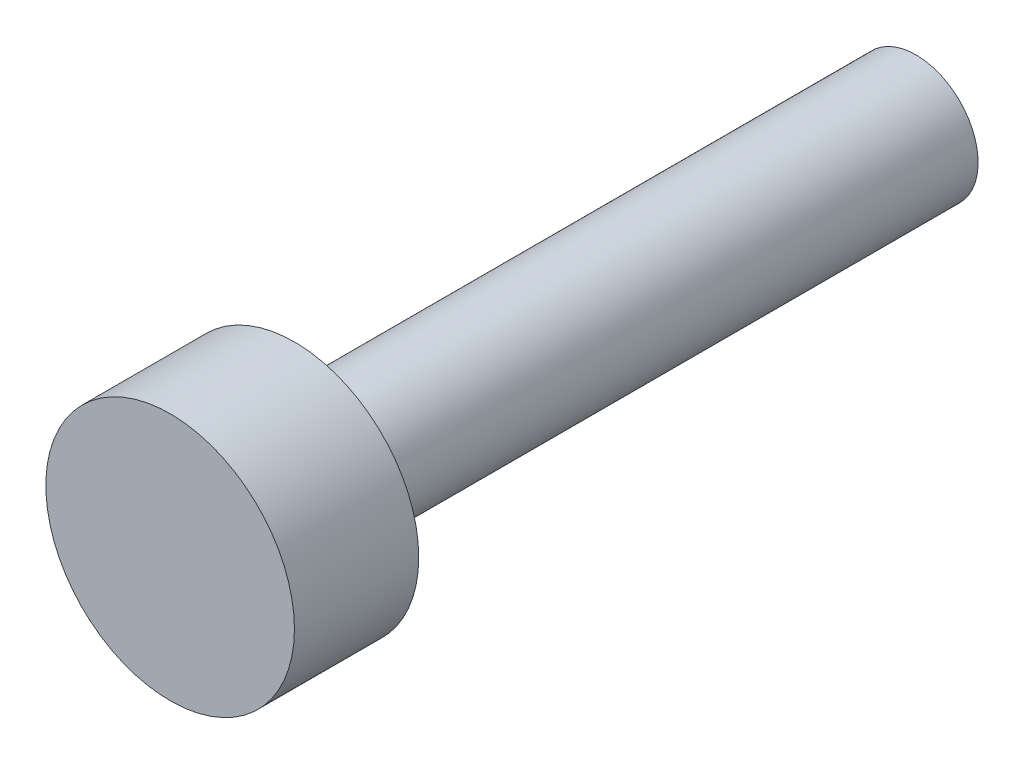
ISO-10303-21;
HEADER;
FILE_DESCRIPTION(('STEP AP214'),'2;1');
FILE_NAME('part.step','',(''),(''),'','','');
FILE_SCHEMA(('AUTOMOTIVE_DESIGN { 1 0 10303 214 1 1 1 1 }'));
ENDSEC;
DATA;
#1=APPLICATION_CONTEXT('core data for automotive mechanical design processes');
#2=APPLICATION_PROTOCOL_DEFINITION('international standard','automotive_design',2000,#1);
#3=PRODUCT_CONTEXT('',#1,'mechanical');
#4=PRODUCT('Part','Part','',(#3));
#5=PRODUCT_RELATED_PRODUCT_CATEGORY('part','',(#4));
#6=PRODUCT_DEFINITION_FORMATION('','',#4);
#7=PRODUCT_DEFINITION_CONTEXT('part definition',#1,'design');
#8=PRODUCT_DEFINITION('design','',#6,#7);
#9=PRODUCT_DEFINITION_SHAPE('','',#8);
#10=(LENGTH_UNIT() NAMED_UNIT(*) SI_UNIT(.MILLI.,.METRE.));
#11=(NAMED_UNIT(*) PLANE_ANGLE_UNIT() SI_UNIT($,.RADIAN.));
#12=(NAMED_UNIT(*) SI_UNIT($,.STERADIAN.) SOLID_ANGLE_UNIT());
#13=UNCERTAINTY_MEASURE_WITH_UNIT(LENGTH_MEASURE(1.E-05),#10,'distance_accuracy_value','');
#14=(GEOMETRIC_REPRESENTATION_CONTEXT(3) GLOBAL_UNCERTAINTY_ASSIGNED_CONTEXT((#13)) GLOBAL_UNIT_ASSIGNED_CONTEXT((#10,
#11,#12)) REPRESENTATION_CONTEXT('',''));
#15=CARTESIAN_POINT('',(0.,0.,0.));
#16=DIRECTION('',(0.,0.,1.));
#17=DIRECTION('',(1.,0.,0.));
#18=AXIS2_PLACEMENT_3D('',#15,#16,#17);
#19=CARTESIAN_POINT('',(0.,0.,19.05));
#20=DIRECTION('',(0.,0.,-1.));
#21=DIRECTION('',(-1.,0.,0.));
#22=AXIS2_PLACEMENT_3D('',#19,#20,#21);
#23=CYLINDRICAL_SURFACE('',#22,1.5875);
#24=CARTESIAN_POINT('',(0.,0.,0.));
#25=DIRECTION('',(0.,0.,1.));
#26=DIRECTION('',(1.,0.,0.));
#27=AXIS2_PLACEMENT_3D('',#24,#25,#26);
#28=CIRCLE('',#27,1.5875);
#29=CARTESIAN_POINT('',(-1.5875,0.,0.));
#30=VERTEX_POINT('',#29);
#31=EDGE_CURVE('E48',#30,#30,#28,.T.);
#32=CARTESIAN_POINT('',(0.,0.,15.875));
#33=DIRECTION('',(0.,0.,1.));
#34=DIRECTION('',(1.,0.,0.));
#35=AXIS2_PLACEMENT_3D('',#32,#33,#34);
#36=CIRCLE('',#35,1.5875);
#37=CARTESIAN_POINT('',(-1.5875,0.,15.875));
#38=VERTEX_POINT('',#37);
#39=EDGE_CURVE('E10',#38,#38,#36,.T.);
#40=CARTESIAN_POINT('',(-1.5875,0.,0.));
#41=CARTESIAN_POINT('',(-1.5875,0.,0.165364583333333));
#42=CARTESIAN_POINT('',(-1.5875,0.,0.330729166666666));
#43=CARTESIAN_POINT('',(-1.5875,0.,0.661458333333332));
#44=CARTESIAN_POINT('',(-1.5875,0.,0.826822916666665));
#45=CARTESIAN_POINT('',(-1.5875,0.,1.15755208333333));
#46=CARTESIAN_POINT('',(-1.5875,0.,1.32291666666667));
#47=CARTESIAN_POINT('',(-1.5875,0.,1.65364583333333));
#48=CARTESIAN_POINT('',(-1.5875,0.,1.81901041666667));
#49=CARTESIAN_POINT('',(-1.5875,0.,2.14973958333333));
#50=CARTESIAN_POINT('',(-1.5875,0.,2.31510416666667));
#51=CARTESIAN_POINT('',(-1.5875,0.,2.64583333333333));
#52=CARTESIAN_POINT('',(-1.5875,0.,2.81119791666667));
#53=CARTESIAN_POINT('',(-1.5875,0.,3.14192708333333));
#54=CARTESIAN_POINT('',(-1.5875,0.,3.30729166666667));
#55=CARTESIAN_POINT('',(-1.5875,0.,3.63802083333333));
#56=CARTESIAN_POINT('',(-1.5875,0.,3.80338541666667));
#57=CARTESIAN_POINT('',(-1.5875,0.,4.13411458333333));
#58=CARTESIAN_POINT('',(-1.5875,0.,4.29947916666666));
#59=CARTESIAN_POINT('',(-1.5875,0.,4.63020833333333));
#60=CARTESIAN_POINT('',(-1.5875,0.,4.79557291666667));
#61=CARTESIAN_POINT('',(-1.5875,0.,5.12630208333333));
#62=CARTESIAN_POINT('',(-1.5875,0.,5.29166666666667));
#63=CARTESIAN_POINT('',(-1.5875,0.,5.62239583333333));
#64=CARTESIAN_POINT('',(-1.5875,0.,5.78776041666667));
#65=CARTESIAN_POINT('',(-1.5875,0.,6.11848958333333));
#66=CARTESIAN_POINT('',(-1.5875,0.,6.28385416666666));
#67=CARTESIAN_POINT('',(-1.5875,0.,6.61458333333333));
#68=CARTESIAN_POINT('',(-1.5875,0.,6.77994791666667));
#69=CARTESIAN_POINT('',(-1.5875,0.,7.11067708333333));
#70=CARTESIAN_POINT('',(-1.5875,0.,7.27604166666667));
#71=CARTESIAN_POINT('',(-1.5875,0.,7.60677083333333));
#72=CARTESIAN_POINT('',(-1.5875,0.,7.77213541666667));
#73=CARTESIAN_POINT('',(-1.5875,0.,8.10286458333333));
#74=CARTESIAN_POINT('',(-1.5875,0.,8.26822916666666));
#75=CARTESIAN_POINT('',(-1.5875,0.,8.59895833333333));
#76=CARTESIAN_POINT('',(-1.5875,0.,8.76432291666666));
#77=CARTESIAN_POINT('',(-1.5875,0.,9.09505208333333));
#78=CARTESIAN_POINT('',(-1.5875,0.,9.26041666666666));
#79=CARTESIAN_POINT('',(-1.5875,0.,9.59114583333333));
#80=CARTESIAN_POINT('',(-1.5875,0.,9.75651041666667));
#81=CARTESIAN_POINT('',(-1.5875,0.,10.0872395833333));
#82=CARTESIAN_POINT('',(-1.5875,0.,10.2526041666667));
#83=CARTESIAN_POINT('',(-1.5875,0.,10.5833333333333));
#84=CARTESIAN_POINT('',(-1.5875,0.,10.7486979166667));
#85=CARTESIAN_POINT('',(-1.5875,0.,11.0794270833333));
#86=CARTESIAN_POINT('',(-1.5875,0.,11.2447916666667));
#87=CARTESIAN_POINT('',(-1.5875,0.,11.5755208333333));
#88=CARTESIAN_POINT('',(-1.5875,0.,11.7408854166667));
#89=CARTESIAN_POINT('',(-1.5875,0.,12.0716145833333));
#90=CARTESIAN_POINT('',(-1.5875,0.,12.2369791666667));
#91=CARTESIAN_POINT('',(-1.5875,0.,12.5677083333333));
#92=CARTESIAN_POINT('',(-1.5875,0.,12.7330729166667));
#93=CARTESIAN_POINT('',(-1.5875,0.,13.0638020833333));
#94=CARTESIAN_POINT('',(-1.5875,0.,13.2291666666667));
#95=CARTESIAN_POINT('',(-1.5875,0.,13.5598958333333));
#96=CARTESIAN_POINT('',(-1.5875,0.,13.7252604166667));
#97=CARTESIAN_POINT('',(-1.5875,0.,14.0559895833333));
#98=CARTESIAN_POINT('',(-1.5875,0.,14.2213541666667));
#99=CARTESIAN_POINT('',(-1.5875,0.,14.5520833333333));
#100=CARTESIAN_POINT('',(-1.5875,0.,14.7174479166667));
#101=CARTESIAN_POINT('',(-1.5875,0.,15.0481770833333));
#102=CARTESIAN_POINT('',(-1.5875,0.,15.2135416666667));
#103=CARTESIAN_POINT('',(-1.5875,0.,15.5442708333333));
#104=CARTESIAN_POINT('',(-1.5875,0.,15.7096354166667));
#105=CARTESIAN_POINT('',(-1.5875,0.,15.875));
#106=B_SPLINE_CURVE_WITH_KNOTS('',3,(#40,#41,#42,#43,#44,#45,#46,#47,#48,#49,#50,#51,#52,#53,
#54,#55,#56,#57,#58,#59,#60,#61,#62,#63,#64,#65,#66,#67,#68,#69,#70,#71,#72,#73,#74,#75,#76,#77,
#78,#79,#80,#81,#82,#83,#84,#85,#86,#87,#88,#89,#90,#91,#92,#93,#94,#95,#96,#97,#98,#99,#100,
#101,#102,#103,#104,#105),.UNSPECIFIED.,.F.,.F.,(4,2,2,2,2,2,2,2,2,2,2,2,2,2,2,2,2,2,2,2,2,2,2,
2,2,2,2,2,2,2,2,2,4),(0.,0.496093749999999,0.992187499999998,1.48828125,1.984375,2.48046875,
2.9765625,3.47265625,3.96875,4.46484375,4.9609375,5.45703125,5.953125,6.44921875,6.9453125,
7.44140625,7.9375,8.43359375,8.9296875,9.42578125,9.921875,10.41796875,10.9140625,11.41015625,
11.90625,12.40234375,12.8984375,13.39453125,13.890625,14.38671875,14.8828125,15.37890625,
15.875),.UNSPECIFIED.);
#107=EDGE_CURVE('BSEAM41',#30,#38,#106,.T.);
#108=ORIENTED_EDGE('',*,*,#31,.T.);
#109=ORIENTED_EDGE('',*,*,#39,.F.);
#110=ORIENTED_EDGE('',*,*,#107,.T.);
#111=ORIENTED_EDGE('',*,*,#107,.F.);
#112=EDGE_LOOP('',(#108,#110,#109,#111));
#113=FACE_BOUND('',#112,.T.);
#114=ADVANCED_FACE('F41',(#113),#23,.T.);
#115=CARTESIAN_POINT('',(0.,0.,0.));
#116=DIRECTION('',(0.,0.,1.));
#117=DIRECTION('',(1.,0.,0.));
#118=AXIS2_PLACEMENT_3D('',#115,#116,#117);
#119=PLANE('',#118);
#120=ORIENTED_EDGE('',*,*,#31,.F.);
#121=EDGE_LOOP('',(#120));
#122=FACE_BOUND('',#121,.T.);
#123=ADVANCED_FACE('F70',(#122),#119,.F.);
#124=CARTESIAN_POINT('',(0.,0.,15.875));
#125=DIRECTION('',(0.,0.,1.));
#126=DIRECTION('',(1.,0.,0.));
#127=AXIS2_PLACEMENT_3D('',#124,#125,#126);
#128=CYLINDRICAL_SURFACE('',#127,3.175);
#129=CARTESIAN_POINT('',(0.,0.,15.875));
#130=DIRECTION('',(0.,0.,1.));
#131=DIRECTION('',(1.,0.,0.));
#132=AXIS2_PLACEMENT_3D('',#129,#130,#131);
#133=CIRCLE('',#132,3.175);
#134=CARTESIAN_POINT('',(3.175,0.,15.875));
#135=VERTEX_POINT('',#134);
#136=EDGE_CURVE('E53',#135,#135,#133,.T.);
#137=ORIENTED_EDGE('',*,*,#136,.T.);
#138=EDGE_LOOP('',(#137));
#139=FACE_BOUND('',#138,.T.);
#140=CARTESIAN_POINT('',(0.,0.,19.05));
#141=DIRECTION('',(0.,0.,1.));
#142=DIRECTION('',(1.,0.,0.));
#143=AXIS2_PLACEMENT_3D('',#140,#141,#142);
#144=CIRCLE('',#143,3.175);
#145=CARTESIAN_POINT('',(3.175,0.,19.05));
#146=VERTEX_POINT('',#145);
#147=EDGE_CURVE('E58',#146,#146,#144,.T.);
#148=ORIENTED_EDGE('',*,*,#147,.F.);
#149=EDGE_LOOP('',(#148));
#150=FACE_BOUND('',#149,.T.);
#151=ADVANCED_FACE('F67',(#139,#150),#128,.T.);
#152=CARTESIAN_POINT('',(0.,0.,15.875));
#153=DIRECTION('',(0.,0.,1.));
#154=DIRECTION('',(1.,0.,0.));
#155=AXIS2_PLACEMENT_3D('',#152,#153,#154);
#156=PLANE('',#155);
#157=ORIENTED_EDGE('',*,*,#39,.T.);
#158=EDGE_LOOP('',(#157));
#159=FACE_BOUND('',#158,.T.);
#160=ORIENTED_EDGE('',*,*,#136,.F.);
#161=EDGE_LOOP('',(#160));
#162=FACE_BOUND('',#161,.T.);
#163=ADVANCED_FACE('F69',(#159,#162),#156,.F.);
#164=CARTESIAN_POINT('',(0.,0.,19.05));
#165=DIRECTION('',(0.,0.,1.));
#166=DIRECTION('',(1.,0.,0.));
#167=AXIS2_PLACEMENT_3D('',#164,#165,#166);
#168=PLANE('',#167);
#169=ORIENTED_EDGE('',*,*,#147,.T.);
#170=EDGE_LOOP('',(#169));
#171=FACE_BOUND('',#170,.T.);
#172=ADVANCED_FACE('F65',(#171),#168,.T.);
#173=CLOSED_SHELL('',(#114,#123,#151,#163,#172));
#174=MANIFOLD_SOLID_BREP('B2',#173);
#175=ADVANCED_BREP_SHAPE_REPRESENTATION('',(#18,#174),#14);
#176=SHAPE_DEFINITION_REPRESENTATION(#9,#175);
ENDSEC;
END-ISO-10303-21;
